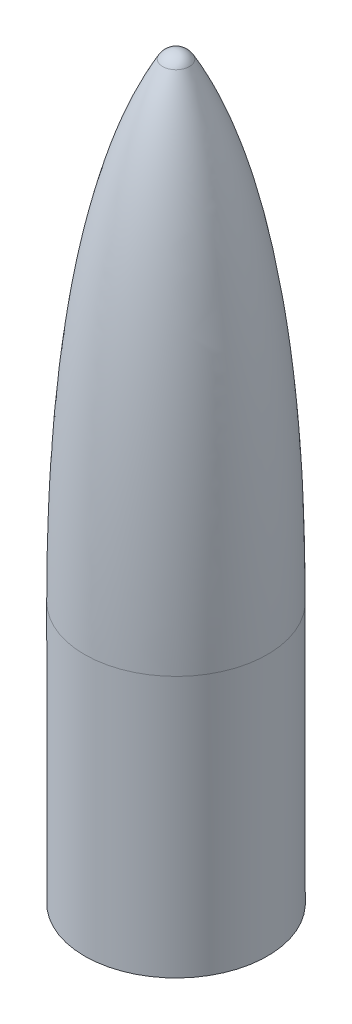
ISO-10303-21;
HEADER;
FILE_DESCRIPTION(('STEP AP214'),'2;1');
FILE_NAME('part.step','',(''),(''),'','','');
FILE_SCHEMA(('AUTOMOTIVE_DESIGN { 1 0 10303 214 1 1 1 1 }'));
ENDSEC;
DATA;
#1=APPLICATION_CONTEXT('core data for automotive mechanical design processes');
#2=APPLICATION_PROTOCOL_DEFINITION('international standard','automotive_design',2000,#1);
#3=PRODUCT_CONTEXT('',#1,'mechanical');
#4=PRODUCT('Part','Part','',(#3));
#5=PRODUCT_RELATED_PRODUCT_CATEGORY('part','',(#4));
#6=PRODUCT_DEFINITION_FORMATION('','',#4);
#7=PRODUCT_DEFINITION_CONTEXT('part definition',#1,'design');
#8=PRODUCT_DEFINITION('design','',#6,#7);
#9=PRODUCT_DEFINITION_SHAPE('','',#8);
#10=(LENGTH_UNIT() NAMED_UNIT(*) SI_UNIT(.MILLI.,.METRE.));
#11=(NAMED_UNIT(*) PLANE_ANGLE_UNIT() SI_UNIT($,.RADIAN.));
#12=(NAMED_UNIT(*) SI_UNIT($,.STERADIAN.) SOLID_ANGLE_UNIT());
#13=UNCERTAINTY_MEASURE_WITH_UNIT(LENGTH_MEASURE(1.E-05),#10,'distance_accuracy_value','');
#14=(GEOMETRIC_REPRESENTATION_CONTEXT(3) GLOBAL_UNCERTAINTY_ASSIGNED_CONTEXT((#13)) GLOBAL_UNIT_ASSIGNED_CONTEXT((#10,
#11,#12)) REPRESENTATION_CONTEXT('',''));
#15=CARTESIAN_POINT('',(0.,0.,0.));
#16=DIRECTION('',(0.,0.,1.));
#17=DIRECTION('',(1.,0.,0.));
#18=AXIS2_PLACEMENT_3D('',#15,#16,#17);
#19=CARTESIAN_POINT('',(0.,141.486675179255,0.));
#20=DIRECTION('',(0.,-1.,0.));
#21=DIRECTION('',(0.,0.,-1.));
#22=AXIS2_PLACEMENT_3D('',#19,#20,#21);
#23=CYLINDRICAL_SURFACE('',#22,16.3);
#24=CARTESIAN_POINT('',(0.,50.,0.));
#25=DIRECTION('',(0.,1.,0.));
#26=DIRECTION('',(0.,0.,1.));
#27=AXIS2_PLACEMENT_3D('',#24,#25,#26);
#28=CIRCLE('',#27,16.3);
#29=CARTESIAN_POINT('',(0.,50.,16.3));
#30=VERTEX_POINT('',#29);
#31=EDGE_CURVE('E180',#30,#30,#28,.T.);
#32=ORIENTED_EDGE('',*,*,#31,.T.);
#33=EDGE_LOOP('',(#32));
#34=FACE_BOUND('',#33,.T.);
#35=CARTESIAN_POINT('',(0.,2.,0.));
#36=DIRECTION('',(0.,-1.,0.));
#37=DIRECTION('',(0.,0.,-1.));
#38=AXIS2_PLACEMENT_3D('',#35,#36,#37);
#39=CIRCLE('',#38,16.3);
#40=CARTESIAN_POINT('',(15.6665248220529,2.,4.5));
#41=VERTEX_POINT('',#40);
#42=CARTESIAN_POINT('',(15.6665248220529,2.,-4.5));
#43=VERTEX_POINT('',#42);
#44=EDGE_CURVE('E115',#41,#43,#39,.F.);
#45=ORIENTED_EDGE('',*,*,#44,.F.);
#46=DIRECTION('',(0.,-1.,0.));
#47=VECTOR('',#46,1.);
#48=CARTESIAN_POINT('',(15.6665248220529,2.,4.5));
#49=LINE('',#48,#47);
#50=CARTESIAN_POINT('',(15.6665248220529,0.,4.5));
#51=VERTEX_POINT('',#50);
#52=EDGE_CURVE('E121',#41,#51,#49,.T.);
#53=ORIENTED_EDGE('',*,*,#52,.T.);
#54=CARTESIAN_POINT('',(0.,0.,0.));
#55=DIRECTION('',(0.,1.,0.));
#56=DIRECTION('',(0.,0.,1.));
#57=AXIS2_PLACEMENT_3D('',#54,#55,#56);
#58=CIRCLE('',#57,16.3);
#59=CARTESIAN_POINT('',(-15.6665248220529,0.,4.5));
#60=VERTEX_POINT('',#59);
#61=EDGE_CURVE('E178',#60,#51,#58,.T.);
#62=ORIENTED_EDGE('',*,*,#61,.F.);
#63=DIRECTION('',(0.,-1.,0.));
#64=VECTOR('',#63,1.);
#65=CARTESIAN_POINT('',(-15.6665248220529,2.,4.5));
#66=LINE('',#65,#64);
#67=CARTESIAN_POINT('',(-15.6665248220529,2.,4.5));
#68=VERTEX_POINT('',#67);
#69=EDGE_CURVE('E172',#68,#60,#66,.T.);
#70=ORIENTED_EDGE('',*,*,#69,.F.);
#71=CARTESIAN_POINT('',(0.,2.,0.));
#72=DIRECTION('',(0.,-1.,0.));
#73=DIRECTION('',(0.,0.,-1.));
#74=AXIS2_PLACEMENT_3D('',#71,#72,#73);
#75=CIRCLE('',#74,16.3);
#76=CARTESIAN_POINT('',(-15.6665248220529,2.,-4.5));
#77=VERTEX_POINT('',#76);
#78=EDGE_CURVE('E155',#77,#68,#75,.F.);
#79=ORIENTED_EDGE('',*,*,#78,.F.);
#80=DIRECTION('',(0.,-1.,0.));
#81=VECTOR('',#80,1.);
#82=CARTESIAN_POINT('',(-15.6665248220529,2.,-4.5));
#83=LINE('',#82,#81);
#84=CARTESIAN_POINT('',(-15.6665248220529,0.,-4.5));
#85=VERTEX_POINT('',#84);
#86=EDGE_CURVE('E168',#77,#85,#83,.T.);
#87=ORIENTED_EDGE('',*,*,#86,.T.);
#88=CARTESIAN_POINT('',(15.6665248220529,0.,-4.5));
#89=VERTEX_POINT('',#88);
#90=EDGE_CURVE('E171',#89,#85,#58,.T.);
#91=ORIENTED_EDGE('',*,*,#90,.F.);
#92=DIRECTION('',(0.,-1.,0.));
#93=VECTOR('',#92,1.);
#94=CARTESIAN_POINT('',(15.6665248220529,2.,-4.5));
#95=LINE('',#94,#93);
#96=EDGE_CURVE('E144',#43,#89,#95,.T.);
#97=ORIENTED_EDGE('',*,*,#96,.F.);
#98=EDGE_LOOP('',(#45,#53,#62,#70,#79,#87,#91,#97));
#99=FACE_BOUND('',#98,.T.);
#100=ADVANCED_FACE('F39',(#34,#99),#23,.F.);
#101=CARTESIAN_POINT('',(-3.33410382581706,136.5,0.));
#102=CARTESIAN_POINT('',(-16.3,113.627892190343,0.));
#103=CARTESIAN_POINT('',(-16.3,50.,0.));
#104=B_SPLINE_CURVE_WITH_KNOTS('',2,(#101,#102,#103),.UNSPECIFIED.,.F.,.F.,(3,3),(0.,1.),.UNSPECIFIED.);
#105=CARTESIAN_POINT('',(0.,50.,0.));
#106=DIRECTION('',(0.,-1.,0.));
#107=AXIS1_PLACEMENT('',#105,#106);
#108=SURFACE_OF_REVOLUTION('',#104,#107);
#109=ORIENTED_EDGE('',*,*,#31,.F.);
#110=EDGE_LOOP('',(#109));
#111=FACE_BOUND('',#110,.T.);
#112=CARTESIAN_POINT('',(0.,136.5,0.));
#113=DIRECTION('',(0.,-1.,0.));
#114=DIRECTION('',(0.,0.,-1.));
#115=AXIS2_PLACEMENT_3D('',#112,#113,#114);
#116=CIRCLE('',#115,3.33410382581706);
#117=CARTESIAN_POINT('',(0.,136.5,-3.33410382581706));
#118=VERTEX_POINT('',#117);
#119=EDGE_CURVE('E234',#118,#118,#116,.T.);
#120=ORIENTED_EDGE('',*,*,#119,.F.);
#121=EDGE_LOOP('',(#120));
#122=FACE_BOUND('',#121,.T.);
#123=ADVANCED_FACE('F196',(#111,#122),#108,.F.);
#124=CARTESIAN_POINT('',(0.,136.5,0.));
#125=DIRECTION('',(0.,-1.,0.));
#126=DIRECTION('',(0.,0.,-1.));
#127=AXIS2_PLACEMENT_3D('',#124,#125,#126);
#128=PLANE('',#127);
#129=ORIENTED_EDGE('',*,*,#119,.T.);
#130=EDGE_LOOP('',(#129));
#131=FACE_BOUND('',#130,.T.);
#132=ADVANCED_FACE('F199',(#131),#128,.T.);
#133=CARTESIAN_POINT('',(0.,50.,0.));
#134=DIRECTION('',(0.,-1.,0.));
#135=DIRECTION('',(0.,0.,-1.));
#136=AXIS2_PLACEMENT_3D('',#133,#134,#135);
#137=CYLINDRICAL_SURFACE('',#136,17.5);
#138=CARTESIAN_POINT('',(0.,50.,0.));
#139=DIRECTION('',(0.,1.,0.));
#140=DIRECTION('',(0.,0.,1.));
#141=AXIS2_PLACEMENT_3D('',#138,#139,#140);
#142=CIRCLE('',#141,17.5);
#143=CARTESIAN_POINT('',(0.,50.,17.5));
#144=VERTEX_POINT('',#143);
#145=EDGE_CURVE('E11',#144,#144,#142,.T.);
#146=ORIENTED_EDGE('',*,*,#145,.F.);
#147=EDGE_LOOP('',(#146));
#148=FACE_BOUND('',#147,.T.);
#149=CARTESIAN_POINT('',(0.,0.,0.));
#150=DIRECTION('',(0.,1.,0.));
#151=DIRECTION('',(0.,0.,1.));
#152=AXIS2_PLACEMENT_3D('',#149,#150,#151);
#153=CIRCLE('',#152,17.5);
#154=CARTESIAN_POINT('',(0.,0.,17.5));
#155=VERTEX_POINT('',#154);
#156=EDGE_CURVE('E43',#155,#155,#153,.T.);
#157=ORIENTED_EDGE('',*,*,#156,.T.);
#158=EDGE_LOOP('',(#157));
#159=FACE_BOUND('',#158,.T.);
#160=ADVANCED_FACE('F41',(#148,#159),#137,.T.);
#161=CARTESIAN_POINT('',(0.,0.,0.));
#162=DIRECTION('',(0.,1.,0.));
#163=DIRECTION('',(0.,0.,1.));
#164=AXIS2_PLACEMENT_3D('',#161,#162,#163);
#165=PLANE('',#164);
#166=ORIENTED_EDGE('',*,*,#61,.T.);
#167=DIRECTION('',(1.,0.,0.));
#168=VECTOR('',#167,1.);
#169=CARTESIAN_POINT('',(0.,0.,4.5));
#170=LINE('',#169,#168);
#171=CARTESIAN_POINT('',(8.3,0.,4.5));
#172=VERTEX_POINT('',#171);
#173=EDGE_CURVE('E138',#172,#51,#170,.T.);
#174=ORIENTED_EDGE('',*,*,#173,.F.);
#175=CARTESIAN_POINT('',(8.3,0.,0.));
#176=DIRECTION('',(0.,-1.,0.));
#177=DIRECTION('',(0.,0.,-1.));
#178=AXIS2_PLACEMENT_3D('',#175,#176,#177);
#179=CIRCLE('',#178,4.5);
#180=CARTESIAN_POINT('',(8.3,0.,-4.5));
#181=VERTEX_POINT('',#180);
#182=EDGE_CURVE('E111',#172,#181,#179,.T.);
#183=ORIENTED_EDGE('',*,*,#182,.T.);
#184=DIRECTION('',(1.,0.,0.));
#185=VECTOR('',#184,1.);
#186=CARTESIAN_POINT('',(0.,0.,-4.5));
#187=LINE('',#186,#185);
#188=EDGE_CURVE('E54',#181,#89,#187,.T.);
#189=ORIENTED_EDGE('',*,*,#188,.T.);
#190=ORIENTED_EDGE('',*,*,#90,.T.);
#191=DIRECTION('',(-1.,0.,0.));
#192=VECTOR('',#191,1.);
#193=CARTESIAN_POINT('',(0.,0.,-4.5));
#194=LINE('',#193,#192);
#195=CARTESIAN_POINT('',(-8.3,0.,-4.5));
#196=VERTEX_POINT('',#195);
#197=EDGE_CURVE('E143',#196,#85,#194,.T.);
#198=ORIENTED_EDGE('',*,*,#197,.F.);
#199=CARTESIAN_POINT('',(-8.3,0.,0.));
#200=DIRECTION('',(0.,-1.,0.));
#201=DIRECTION('',(0.,0.,-1.));
#202=AXIS2_PLACEMENT_3D('',#199,#200,#201);
#203=CIRCLE('',#202,4.5);
#204=CARTESIAN_POINT('',(-8.3,0.,4.5));
#205=VERTEX_POINT('',#204);
#206=EDGE_CURVE('E163',#205,#196,#203,.F.);
#207=ORIENTED_EDGE('',*,*,#206,.F.);
#208=DIRECTION('',(-1.,0.,0.));
#209=VECTOR('',#208,1.);
#210=CARTESIAN_POINT('',(0.,0.,4.5));
#211=LINE('',#210,#209);
#212=EDGE_CURVE('E61',#205,#60,#211,.T.);
#213=ORIENTED_EDGE('',*,*,#212,.T.);
#214=EDGE_LOOP('',(#166,#174,#183,#189,#190,#198,#207,#213));
#215=FACE_BOUND('',#214,.T.);
#216=ORIENTED_EDGE('',*,*,#156,.F.);
#217=EDGE_LOOP('',(#216));
#218=FACE_BOUND('',#217,.T.);
#219=CARTESIAN_POINT('',(-8.3,0.,0.));
#220=DIRECTION('',(0.,-1.,0.));
#221=DIRECTION('',(0.,0.,-1.));
#222=AXIS2_PLACEMENT_3D('',#219,#220,#221);
#223=CIRCLE('',#222,2.2);
#224=CARTESIAN_POINT('',(-8.3,0.,-2.2));
#225=VERTEX_POINT('',#224);
#226=EDGE_CURVE('E150',#225,#225,#223,.T.);
#227=ORIENTED_EDGE('',*,*,#226,.F.);
#228=EDGE_LOOP('',(#227));
#229=FACE_BOUND('',#228,.T.);
#230=CARTESIAN_POINT('',(8.3,0.,0.));
#231=DIRECTION('',(0.,-1.,0.));
#232=DIRECTION('',(0.,0.,-1.));
#233=AXIS2_PLACEMENT_3D('',#230,#231,#232);
#234=CIRCLE('',#233,2.2);
#235=CARTESIAN_POINT('',(8.3,0.,-2.2));
#236=VERTEX_POINT('',#235);
#237=EDGE_CURVE('E135',#236,#236,#234,.F.);
#238=ORIENTED_EDGE('',*,*,#237,.T.);
#239=EDGE_LOOP('',(#238));
#240=FACE_BOUND('',#239,.T.);
#241=ADVANCED_FACE('F202',(#215,#218,#229,#240),#165,.F.);
#242=CARTESIAN_POINT('',(0.,138.55443864119,0.));
#243=DIRECTION('',(0.,-1.,0.));
#244=DIRECTION('',(-1.,0.,0.));
#245=AXIS2_PLACEMENT_3D('',#242,#243,#244);
#246=SPHERICAL_SURFACE('',#245,2.93123653806434);
#247=CARTESIAN_POINT('',(0.,140.,0.));
#248=DIRECTION('',(0.,-1.,0.));
#249=DIRECTION('',(0.,0.,-1.));
#250=AXIS2_PLACEMENT_3D('',#247,#248,#249);
#251=CIRCLE('',#250,2.55000000000001);
#252=CARTESIAN_POINT('',(0.,140.,-2.55000000000001));
#253=VERTEX_POINT('',#252);
#254=EDGE_CURVE('E183',#253,#253,#251,.T.);
#255=ORIENTED_EDGE('',*,*,#254,.F.);
#256=EDGE_LOOP('',(#255));
#257=FACE_BOUND('',#256,.T.);
#258=ADVANCED_FACE('F204',(#257),#246,.T.);
#259=CARTESIAN_POINT('',(-2.55,140.,0.));
#260=CARTESIAN_POINT('',(-17.5,113.627892190343,0.));
#261=CARTESIAN_POINT('',(-17.5,50.,0.));
#262=B_SPLINE_CURVE_WITH_KNOTS('',2,(#259,#260,#261),.UNSPECIFIED.,.F.,.F.,(3,3),(0.,1.),.UNSPECIFIED.);
#263=CARTESIAN_POINT('',(0.,50.,0.));
#264=DIRECTION('',(0.,-1.,0.));
#265=AXIS1_PLACEMENT('',#263,#264);
#266=SURFACE_OF_REVOLUTION('',#262,#265);
#267=ORIENTED_EDGE('',*,*,#145,.T.);
#268=EDGE_LOOP('',(#267));
#269=FACE_BOUND('',#268,.T.);
#270=ORIENTED_EDGE('',*,*,#254,.T.);
#271=EDGE_LOOP('',(#270));
#272=FACE_BOUND('',#271,.T.);
#273=ADVANCED_FACE('F209',(#269,#272),#266,.T.);
#274=CARTESIAN_POINT('',(0.,2.,-4.5));
#275=DIRECTION('',(0.,0.,1.));
#276=DIRECTION('',(1.,0.,0.));
#277=AXIS2_PLACEMENT_3D('',#274,#275,#276);
#278=PLANE('',#277);
#279=ORIENTED_EDGE('',*,*,#197,.T.);
#280=ORIENTED_EDGE('',*,*,#86,.F.);
#281=DIRECTION('',(-1.,0.,0.));
#282=VECTOR('',#281,1.);
#283=CARTESIAN_POINT('',(0.,2.,-4.5));
#284=LINE('',#283,#282);
#285=CARTESIAN_POINT('',(-8.3,2.,-4.5));
#286=VERTEX_POINT('',#285);
#287=EDGE_CURVE('E147',#286,#77,#284,.T.);
#288=ORIENTED_EDGE('',*,*,#287,.F.);
#289=DIRECTION('',(0.,-1.,0.));
#290=VECTOR('',#289,1.);
#291=CARTESIAN_POINT('',(-8.3,2.,-4.5));
#292=LINE('',#291,#290);
#293=EDGE_CURVE('E160',#286,#196,#292,.T.);
#294=ORIENTED_EDGE('',*,*,#293,.T.);
#295=EDGE_LOOP('',(#279,#280,#288,#294));
#296=FACE_BOUND('',#295,.T.);
#297=ADVANCED_FACE('F221',(#296),#278,.F.);
#298=CARTESIAN_POINT('',(0.,2.,4.5));
#299=DIRECTION('',(0.,0.,1.));
#300=DIRECTION('',(1.,0.,0.));
#301=AXIS2_PLACEMENT_3D('',#298,#299,#300);
#302=PLANE('',#301);
#303=ORIENTED_EDGE('',*,*,#212,.F.);
#304=DIRECTION('',(0.,-1.,0.));
#305=VECTOR('',#304,1.);
#306=CARTESIAN_POINT('',(-8.3,2.,4.5));
#307=LINE('',#306,#305);
#308=CARTESIAN_POINT('',(-8.3,2.,4.5));
#309=VERTEX_POINT('',#308);
#310=EDGE_CURVE('E174',#309,#205,#307,.T.);
#311=ORIENTED_EDGE('',*,*,#310,.F.);
#312=DIRECTION('',(-1.,0.,0.));
#313=VECTOR('',#312,1.);
#314=CARTESIAN_POINT('',(0.,2.,4.5));
#315=LINE('',#314,#313);
#316=EDGE_CURVE('E152',#309,#68,#315,.T.);
#317=ORIENTED_EDGE('',*,*,#316,.T.);
#318=ORIENTED_EDGE('',*,*,#69,.T.);
#319=EDGE_LOOP('',(#303,#311,#317,#318));
#320=FACE_BOUND('',#319,.T.);
#321=ADVANCED_FACE('F228',(#320),#302,.T.);
#322=CARTESIAN_POINT('',(-8.3,2.,0.));
#323=DIRECTION('',(0.,-1.,0.));
#324=DIRECTION('',(0.,0.,-1.));
#325=AXIS2_PLACEMENT_3D('',#322,#323,#324);
#326=CYLINDRICAL_SURFACE('',#325,4.5);
#327=ORIENTED_EDGE('',*,*,#206,.T.);
#328=ORIENTED_EDGE('',*,*,#293,.F.);
#329=CARTESIAN_POINT('',(-8.3,2.,0.));
#330=DIRECTION('',(0.,-1.,0.));
#331=DIRECTION('',(0.,0.,-1.));
#332=AXIS2_PLACEMENT_3D('',#329,#330,#331);
#333=CIRCLE('',#332,4.5);
#334=EDGE_CURVE('E149',#309,#286,#333,.F.);
#335=ORIENTED_EDGE('',*,*,#334,.F.);
#336=ORIENTED_EDGE('',*,*,#310,.T.);
#337=EDGE_LOOP('',(#327,#328,#335,#336));
#338=FACE_BOUND('',#337,.T.);
#339=ADVANCED_FACE('F269',(#338),#326,.T.);
#340=CARTESIAN_POINT('',(-8.3,2.,0.));
#341=DIRECTION('',(0.,-1.,0.));
#342=DIRECTION('',(0.,0.,-1.));
#343=AXIS2_PLACEMENT_3D('',#340,#341,#342);
#344=CYLINDRICAL_SURFACE('',#343,2.2);
#345=CARTESIAN_POINT('',(-8.3,2.,0.));
#346=DIRECTION('',(0.,-1.,0.));
#347=DIRECTION('',(0.,0.,-1.));
#348=AXIS2_PLACEMENT_3D('',#345,#346,#347);
#349=CIRCLE('',#348,2.2);
#350=CARTESIAN_POINT('',(-8.3,2.,-2.2));
#351=VERTEX_POINT('',#350);
#352=EDGE_CURVE('E157',#351,#351,#349,.T.);
#353=ORIENTED_EDGE('',*,*,#352,.F.);
#354=EDGE_LOOP('',(#353));
#355=FACE_BOUND('',#354,.T.);
#356=ORIENTED_EDGE('',*,*,#226,.T.);
#357=EDGE_LOOP('',(#356));
#358=FACE_BOUND('',#357,.T.);
#359=ADVANCED_FACE('F265',(#355,#358),#344,.F.);
#360=CARTESIAN_POINT('',(0.,2.,0.));
#361=DIRECTION('',(0.,-1.,0.));
#362=DIRECTION('',(0.,0.,-1.));
#363=AXIS2_PLACEMENT_3D('',#360,#361,#362);
#364=PLANE('',#363);
#365=ORIENTED_EDGE('',*,*,#287,.T.);
#366=ORIENTED_EDGE('',*,*,#78,.T.);
#367=ORIENTED_EDGE('',*,*,#316,.F.);
#368=ORIENTED_EDGE('',*,*,#334,.T.);
#369=EDGE_LOOP('',(#365,#366,#367,#368));
#370=FACE_BOUND('',#369,.T.);
#371=ORIENTED_EDGE('',*,*,#352,.T.);
#372=EDGE_LOOP('',(#371));
#373=FACE_BOUND('',#372,.T.);
#374=ADVANCED_FACE('F262',(#370,#373),#364,.F.);
#375=CARTESIAN_POINT('',(0.,2.,4.5));
#376=DIRECTION('',(0.,0.,-1.));
#377=DIRECTION('',(-1.,0.,0.));
#378=AXIS2_PLACEMENT_3D('',#375,#376,#377);
#379=PLANE('',#378);
#380=ORIENTED_EDGE('',*,*,#173,.T.);
#381=ORIENTED_EDGE('',*,*,#52,.F.);
#382=DIRECTION('',(1.,0.,0.));
#383=VECTOR('',#382,1.);
#384=CARTESIAN_POINT('',(0.,2.,4.5));
#385=LINE('',#384,#383);
#386=CARTESIAN_POINT('',(8.3,2.,4.5));
#387=VERTEX_POINT('',#386);
#388=EDGE_CURVE('E118',#387,#41,#385,.T.);
#389=ORIENTED_EDGE('',*,*,#388,.F.);
#390=DIRECTION('',(0.,-1.,0.));
#391=VECTOR('',#390,1.);
#392=CARTESIAN_POINT('',(8.3,2.,4.5));
#393=LINE('',#392,#391);
#394=EDGE_CURVE('E106',#387,#172,#393,.T.);
#395=ORIENTED_EDGE('',*,*,#394,.T.);
#396=EDGE_LOOP('',(#380,#381,#389,#395));
#397=FACE_BOUND('',#396,.T.);
#398=ADVANCED_FACE('F119',(#397),#379,.F.);
#399=CARTESIAN_POINT('',(0.,2.,-4.5));
#400=DIRECTION('',(0.,0.,-1.));
#401=DIRECTION('',(-1.,0.,0.));
#402=AXIS2_PLACEMENT_3D('',#399,#400,#401);
#403=PLANE('',#402);
#404=ORIENTED_EDGE('',*,*,#188,.F.);
#405=DIRECTION('',(0.,-1.,0.));
#406=VECTOR('',#405,1.);
#407=CARTESIAN_POINT('',(8.3,2.,-4.5));
#408=LINE('',#407,#406);
#409=CARTESIAN_POINT('',(8.3,2.,-4.5));
#410=VERTEX_POINT('',#409);
#411=EDGE_CURVE('E114',#410,#181,#408,.T.);
#412=ORIENTED_EDGE('',*,*,#411,.F.);
#413=DIRECTION('',(1.,0.,0.));
#414=VECTOR('',#413,1.);
#415=CARTESIAN_POINT('',(0.,2.,-4.5));
#416=LINE('',#415,#414);
#417=EDGE_CURVE('E129',#410,#43,#416,.T.);
#418=ORIENTED_EDGE('',*,*,#417,.T.);
#419=ORIENTED_EDGE('',*,*,#96,.T.);
#420=EDGE_LOOP('',(#404,#412,#418,#419));
#421=FACE_BOUND('',#420,.T.);
#422=ADVANCED_FACE('F249',(#421),#403,.T.);
#423=CARTESIAN_POINT('',(8.3,2.,0.));
#424=DIRECTION('',(0.,-1.,0.));
#425=DIRECTION('',(0.,0.,-1.));
#426=AXIS2_PLACEMENT_3D('',#423,#424,#425);
#427=CYLINDRICAL_SURFACE('',#426,2.2);
#428=CARTESIAN_POINT('',(8.3,2.,0.));
#429=DIRECTION('',(0.,-1.,0.));
#430=DIRECTION('',(0.,0.,-1.));
#431=AXIS2_PLACEMENT_3D('',#428,#429,#430);
#432=CIRCLE('',#431,2.2);
#433=CARTESIAN_POINT('',(8.3,2.,-2.2));
#434=VERTEX_POINT('',#433);
#435=EDGE_CURVE('E124',#434,#434,#432,.F.);
#436=ORIENTED_EDGE('',*,*,#435,.T.);
#437=EDGE_LOOP('',(#436));
#438=FACE_BOUND('',#437,.T.);
#439=ORIENTED_EDGE('',*,*,#237,.F.);
#440=EDGE_LOOP('',(#439));
#441=FACE_BOUND('',#440,.T.);
#442=ADVANCED_FACE('F247',(#438,#441),#427,.F.);
#443=CARTESIAN_POINT('',(8.3,2.,0.));
#444=DIRECTION('',(0.,-1.,0.));
#445=DIRECTION('',(0.,0.,-1.));
#446=AXIS2_PLACEMENT_3D('',#443,#444,#445);
#447=CYLINDRICAL_SURFACE('',#446,4.5);
#448=ORIENTED_EDGE('',*,*,#182,.F.);
#449=ORIENTED_EDGE('',*,*,#394,.F.);
#450=CARTESIAN_POINT('',(8.3,2.,0.));
#451=DIRECTION('',(0.,-1.,0.));
#452=DIRECTION('',(0.,0.,-1.));
#453=AXIS2_PLACEMENT_3D('',#450,#451,#452);
#454=CIRCLE('',#453,4.5);
#455=EDGE_CURVE('E110',#387,#410,#454,.T.);
#456=ORIENTED_EDGE('',*,*,#455,.T.);
#457=ORIENTED_EDGE('',*,*,#411,.T.);
#458=EDGE_LOOP('',(#448,#449,#456,#457));
#459=FACE_BOUND('',#458,.T.);
#460=ADVANCED_FACE('F108',(#459),#447,.T.);
#461=CARTESIAN_POINT('',(0.,2.,0.));
#462=DIRECTION('',(0.,-1.,0.));
#463=DIRECTION('',(0.,0.,-1.));
#464=AXIS2_PLACEMENT_3D('',#461,#462,#463);
#465=PLANE('',#464);
#466=ORIENTED_EDGE('',*,*,#435,.F.);
#467=EDGE_LOOP('',(#466));
#468=FACE_BOUND('',#467,.T.);
#469=ORIENTED_EDGE('',*,*,#388,.T.);
#470=ORIENTED_EDGE('',*,*,#44,.T.);
#471=ORIENTED_EDGE('',*,*,#417,.F.);
#472=ORIENTED_EDGE('',*,*,#455,.F.);
#473=EDGE_LOOP('',(#469,#470,#471,#472));
#474=FACE_BOUND('',#473,.T.);
#475=ADVANCED_FACE('F127',(#468,#474),#465,.F.);
#476=CLOSED_SHELL('',(#100,#123,#132,#160,#241,#258,#273,#297,#321,#339,#359,#374,#398,#422,
#442,#460,#475));
#477=MANIFOLD_SOLID_BREP('B2',#476);
#478=ADVANCED_BREP_SHAPE_REPRESENTATION('',(#18,#477),#14);
#479=SHAPE_DEFINITION_REPRESENTATION(#9,#478);
ENDSEC;
END-ISO-10303-21;
